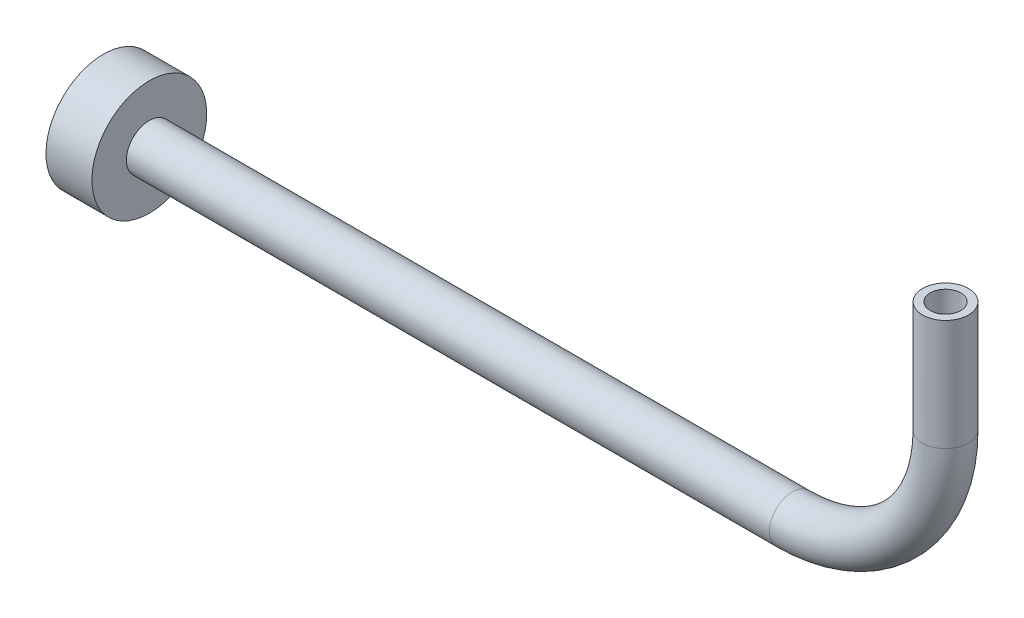
ISO-10303-21;
HEADER;
FILE_DESCRIPTION(('STEP AP214'),'2;1');
FILE_NAME('part.step','',(''),(''),'','','');
FILE_SCHEMA(('AUTOMOTIVE_DESIGN { 1 0 10303 214 1 1 1 1 }'));
ENDSEC;
DATA;
#1=APPLICATION_CONTEXT('core data for automotive mechanical design processes');
#2=APPLICATION_PROTOCOL_DEFINITION('international standard','automotive_design',2000,#1);
#3=PRODUCT_CONTEXT('',#1,'mechanical');
#4=PRODUCT('Part','Part','',(#3));
#5=PRODUCT_RELATED_PRODUCT_CATEGORY('part','',(#4));
#6=PRODUCT_DEFINITION_FORMATION('','',#4);
#7=PRODUCT_DEFINITION_CONTEXT('part definition',#1,'design');
#8=PRODUCT_DEFINITION('design','',#6,#7);
#9=PRODUCT_DEFINITION_SHAPE('','',#8);
#10=(LENGTH_UNIT() NAMED_UNIT(*) SI_UNIT(.MILLI.,.METRE.));
#11=(NAMED_UNIT(*) PLANE_ANGLE_UNIT() SI_UNIT($,.RADIAN.));
#12=(NAMED_UNIT(*) SI_UNIT($,.STERADIAN.) SOLID_ANGLE_UNIT());
#13=UNCERTAINTY_MEASURE_WITH_UNIT(LENGTH_MEASURE(1.E-05),#10,'distance_accuracy_value','');
#14=(GEOMETRIC_REPRESENTATION_CONTEXT(3) GLOBAL_UNCERTAINTY_ASSIGNED_CONTEXT((#13)) GLOBAL_UNIT_ASSIGNED_CONTEXT((#10,
#11,#12)) REPRESENTATION_CONTEXT('',''));
#15=CARTESIAN_POINT('',(0.,0.,0.));
#16=DIRECTION('',(0.,0.,1.));
#17=DIRECTION('',(1.,0.,0.));
#18=AXIS2_PLACEMENT_3D('',#15,#16,#17);
#19=CARTESIAN_POINT('',(-13.,-24.5,0.));
#20=DIRECTION('',(0.,0.,-1.));
#21=DIRECTION('',(-1.,0.,0.));
#22=AXIS2_PLACEMENT_3D('',#19,#20,#21);
#23=TOROIDAL_SURFACE('',#22,20.,1.99999999999997);
#24=CARTESIAN_POINT('',(7.00000000000006,-24.5,0.));
#25=DIRECTION('',(0.,1.,0.));
#26=DIRECTION('',(-1.,0.,0.));
#27=AXIS2_PLACEMENT_3D('',#24,#25,#26);
#28=CIRCLE('',#27,1.99999999999997);
#29=CARTESIAN_POINT('',(5.0000000000001,-24.5,0.));
#30=VERTEX_POINT('',#29);
#31=EDGE_CURVE('E33',#30,#30,#28,.T.);
#32=ORIENTED_EDGE('',*,*,#31,.T.);
#33=EDGE_LOOP('',(#32));
#34=FACE_BOUND('',#33,.T.);
#35=CARTESIAN_POINT('',(-12.9999999999999,-44.5,0.));
#36=DIRECTION('',(-1.,0.,0.));
#37=DIRECTION('',(0.,-1.,0.));
#38=AXIS2_PLACEMENT_3D('',#35,#36,#37);
#39=CIRCLE('',#38,1.99999999999997);
#40=CARTESIAN_POINT('',(-12.9999999999999,-46.5,0.));
#41=VERTEX_POINT('',#40);
#42=EDGE_CURVE('E48',#41,#41,#39,.T.);
#43=ORIENTED_EDGE('',*,*,#42,.T.);
#44=EDGE_LOOP('',(#43));
#45=FACE_BOUND('',#44,.T.);
#46=ADVANCED_FACE('F16',(#34,#45),#23,.F.);
#47=CARTESIAN_POINT('',(7.00000000000006,-24.5,0.));
#48=DIRECTION('',(0.,1.,0.));
#49=DIRECTION('',(-1.,0.,0.));
#50=AXIS2_PLACEMENT_3D('',#47,#48,#49);
#51=CYLINDRICAL_SURFACE('',#50,1.99999999999997);
#52=CARTESIAN_POINT('',(7.00000000000006,-9.99999999999995,0.));
#53=DIRECTION('',(0.,1.,0.));
#54=DIRECTION('',(-1.,0.,0.));
#55=AXIS2_PLACEMENT_3D('',#52,#53,#54);
#56=CIRCLE('',#55,1.99999999999997);
#57=CARTESIAN_POINT('',(5.00000000000009,-9.99999999999995,0.));
#58=VERTEX_POINT('',#57);
#59=EDGE_CURVE('E20',#58,#58,#56,.T.);
#60=ORIENTED_EDGE('',*,*,#59,.T.);
#61=EDGE_LOOP('',(#60));
#62=FACE_BOUND('',#61,.T.);
#63=ORIENTED_EDGE('',*,*,#31,.F.);
#64=EDGE_LOOP('',(#63));
#65=FACE_BOUND('',#64,.T.);
#66=ADVANCED_FACE('F86',(#62,#65),#51,.F.);
#67=CARTESIAN_POINT('',(-12.9999999999999,-44.5,0.));
#68=DIRECTION('',(-1.,0.,0.));
#69=DIRECTION('',(0.,-1.,0.));
#70=AXIS2_PLACEMENT_3D('',#67,#68,#69);
#71=CYLINDRICAL_SURFACE('',#70,1.99999999999997);
#72=CARTESIAN_POINT('',(-103.,-44.5,0.));
#73=DIRECTION('',(-1.,0.,0.));
#74=DIRECTION('',(0.,-1.,0.));
#75=AXIS2_PLACEMENT_3D('',#72,#73,#74);
#76=CIRCLE('',#75,1.99999999999997);
#77=CARTESIAN_POINT('',(-103.,-46.5,0.));
#78=VERTEX_POINT('',#77);
#79=EDGE_CURVE('E43',#78,#78,#76,.F.);
#80=ORIENTED_EDGE('',*,*,#79,.F.);
#81=EDGE_LOOP('',(#80));
#82=FACE_BOUND('',#81,.T.);
#83=ORIENTED_EDGE('',*,*,#42,.F.);
#84=EDGE_LOOP('',(#83));
#85=FACE_BOUND('',#84,.T.);
#86=ADVANCED_FACE('F83',(#82,#85),#71,.F.);
#87=CARTESIAN_POINT('',(7.00000000000006,-9.99999999999995,-1.11022302462516E-13));
#88=DIRECTION('',(0.,-1.,0.));
#89=DIRECTION('',(0.,0.,-1.));
#90=AXIS2_PLACEMENT_3D('',#87,#88,#89);
#91=PLANE('',#90);
#92=CARTESIAN_POINT('',(7.00000000000006,-9.99999999999995,0.));
#93=DIRECTION('',(0.,1.,0.));
#94=DIRECTION('',(-1.,0.,0.));
#95=AXIS2_PLACEMENT_3D('',#92,#93,#94);
#96=CIRCLE('',#95,2.99999999999997);
#97=CARTESIAN_POINT('',(4.00000000000009,-9.99999999999995,0.));
#98=VERTEX_POINT('',#97);
#99=EDGE_CURVE('E41',#98,#98,#96,.F.);
#100=ORIENTED_EDGE('',*,*,#99,.F.);
#101=EDGE_LOOP('',(#100));
#102=FACE_BOUND('',#101,.T.);
#103=ORIENTED_EDGE('',*,*,#59,.F.);
#104=EDGE_LOOP('',(#103));
#105=FACE_BOUND('',#104,.T.);
#106=ADVANCED_FACE('F79',(#102,#105),#91,.F.);
#107=CARTESIAN_POINT('',(-103.,-44.5,0.));
#108=DIRECTION('',(-1.,0.,0.));
#109=DIRECTION('',(0.,-1.,0.));
#110=AXIS2_PLACEMENT_3D('',#107,#108,#109);
#111=PLANE('',#110);
#112=CARTESIAN_POINT('',(-103.,-44.5,0.));
#113=DIRECTION('',(-1.,0.,0.));
#114=DIRECTION('',(0.,-1.,0.));
#115=AXIS2_PLACEMENT_3D('',#112,#113,#114);
#116=CIRCLE('',#115,7.5);
#117=CARTESIAN_POINT('',(-103.,-52.,0.));
#118=VERTEX_POINT('',#117);
#119=EDGE_CURVE('E38',#118,#118,#116,.F.);
#120=ORIENTED_EDGE('',*,*,#119,.F.);
#121=EDGE_LOOP('',(#120));
#122=FACE_BOUND('',#121,.T.);
#123=ORIENTED_EDGE('',*,*,#79,.T.);
#124=EDGE_LOOP('',(#123));
#125=FACE_BOUND('',#124,.T.);
#126=ADVANCED_FACE('F75',(#122,#125),#111,.T.);
#127=CARTESIAN_POINT('',(7.00000000000006,-24.5,0.));
#128=DIRECTION('',(0.,1.,0.));
#129=DIRECTION('',(-1.,0.,0.));
#130=AXIS2_PLACEMENT_3D('',#127,#128,#129);
#131=CYLINDRICAL_SURFACE('',#130,2.99999999999997);
#132=CARTESIAN_POINT('',(7.00000000000005,-24.5,0.));
#133=DIRECTION('',(0.,-1.,0.));
#134=DIRECTION('',(1.,0.,0.));
#135=AXIS2_PLACEMENT_3D('',#132,#133,#134);
#136=CIRCLE('',#135,2.99999999999997);
#137=CARTESIAN_POINT('',(10.,-24.5,0.));
#138=VERTEX_POINT('',#137);
#139=EDGE_CURVE('E37',#138,#138,#136,.T.);
#140=ORIENTED_EDGE('',*,*,#139,.F.);
#141=EDGE_LOOP('',(#140));
#142=FACE_BOUND('',#141,.T.);
#143=ORIENTED_EDGE('',*,*,#99,.T.);
#144=EDGE_LOOP('',(#143));
#145=FACE_BOUND('',#144,.T.);
#146=ADVANCED_FACE('F71',(#142,#145),#131,.T.);
#147=CARTESIAN_POINT('',(-97.,-44.5,0.));
#148=DIRECTION('',(-1.,0.,0.));
#149=DIRECTION('',(0.,-1.,0.));
#150=AXIS2_PLACEMENT_3D('',#147,#148,#149);
#151=CYLINDRICAL_SURFACE('',#150,7.5);
#152=ORIENTED_EDGE('',*,*,#119,.T.);
#153=EDGE_LOOP('',(#152));
#154=FACE_BOUND('',#153,.T.);
#155=CARTESIAN_POINT('',(-97.,-44.5,0.));
#156=DIRECTION('',(-1.,0.,0.));
#157=DIRECTION('',(0.,-1.,0.));
#158=AXIS2_PLACEMENT_3D('',#155,#156,#157);
#159=CIRCLE('',#158,7.5);
#160=CARTESIAN_POINT('',(-97.,-52.,0.));
#161=VERTEX_POINT('',#160);
#162=EDGE_CURVE('E29',#161,#161,#159,.T.);
#163=ORIENTED_EDGE('',*,*,#162,.T.);
#164=EDGE_LOOP('',(#163));
#165=FACE_BOUND('',#164,.T.);
#166=ADVANCED_FACE('F66',(#154,#165),#151,.T.);
#167=CARTESIAN_POINT('',(-13.,-24.5,0.));
#168=DIRECTION('',(0.,0.,-1.));
#169=DIRECTION('',(-1.,0.,0.));
#170=AXIS2_PLACEMENT_3D('',#167,#168,#169);
#171=TOROIDAL_SURFACE('',#170,20.,2.99999999999997);
#172=CARTESIAN_POINT('',(-12.9999999999999,-44.5,0.));
#173=DIRECTION('',(-1.,0.,0.));
#174=DIRECTION('',(0.,-1.,0.));
#175=AXIS2_PLACEMENT_3D('',#172,#173,#174);
#176=CIRCLE('',#175,2.99999999999997);
#177=CARTESIAN_POINT('',(-12.9999999999999,-47.5,0.));
#178=VERTEX_POINT('',#177);
#179=EDGE_CURVE('E24',#178,#178,#176,.T.);
#180=ORIENTED_EDGE('',*,*,#179,.F.);
#181=EDGE_LOOP('',(#180));
#182=FACE_BOUND('',#181,.T.);
#183=ORIENTED_EDGE('',*,*,#139,.T.);
#184=EDGE_LOOP('',(#183));
#185=FACE_BOUND('',#184,.T.);
#186=ADVANCED_FACE('F61',(#182,#185),#171,.T.);
#187=CARTESIAN_POINT('',(-97.,-44.5,0.));
#188=DIRECTION('',(-1.,0.,0.));
#189=DIRECTION('',(0.,-1.,0.));
#190=AXIS2_PLACEMENT_3D('',#187,#188,#189);
#191=PLANE('',#190);
#192=ORIENTED_EDGE('',*,*,#162,.F.);
#193=EDGE_LOOP('',(#192));
#194=FACE_BOUND('',#193,.T.);
#195=CARTESIAN_POINT('',(-97.,-44.5,0.));
#196=DIRECTION('',(-1.,0.,0.));
#197=DIRECTION('',(0.,-1.,0.));
#198=AXIS2_PLACEMENT_3D('',#195,#196,#197);
#199=CIRCLE('',#198,2.99999999999997);
#200=CARTESIAN_POINT('',(-97.,-47.5,0.));
#201=VERTEX_POINT('',#200);
#202=EDGE_CURVE('E10',#201,#201,#199,.F.);
#203=ORIENTED_EDGE('',*,*,#202,.F.);
#204=EDGE_LOOP('',(#203));
#205=FACE_BOUND('',#204,.T.);
#206=ADVANCED_FACE('F65',(#194,#205),#191,.F.);
#207=CARTESIAN_POINT('',(-12.9999999999999,-44.5,0.));
#208=DIRECTION('',(-1.,0.,0.));
#209=DIRECTION('',(0.,-1.,0.));
#210=AXIS2_PLACEMENT_3D('',#207,#208,#209);
#211=CYLINDRICAL_SURFACE('',#210,2.99999999999997);
#212=ORIENTED_EDGE('',*,*,#179,.T.);
#213=EDGE_LOOP('',(#212));
#214=FACE_BOUND('',#213,.T.);
#215=ORIENTED_EDGE('',*,*,#202,.T.);
#216=EDGE_LOOP('',(#215));
#217=FACE_BOUND('',#216,.T.);
#218=ADVANCED_FACE('F95',(#214,#217),#211,.T.);
#219=CLOSED_SHELL('',(#46,#66,#86,#106,#126,#146,#166,#186,#206,#218));
#220=MANIFOLD_SOLID_BREP('B1',#219);
#221=ADVANCED_BREP_SHAPE_REPRESENTATION('',(#18,#220),#14);
#222=SHAPE_DEFINITION_REPRESENTATION(#9,#221);
ENDSEC;
END-ISO-10303-21;
